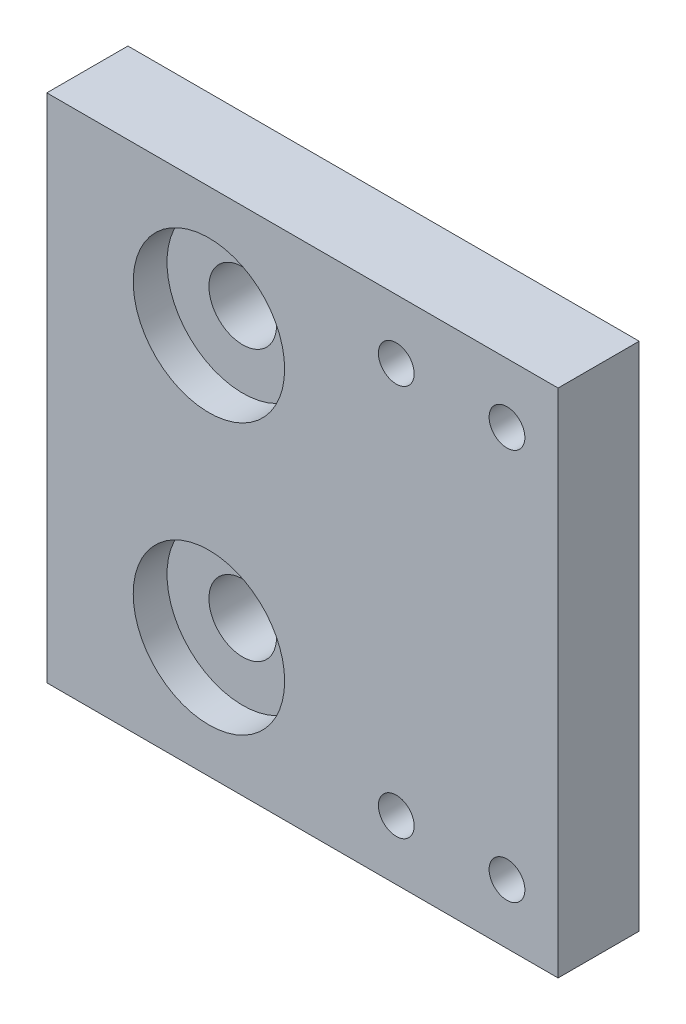
ISO-10303-21;
HEADER;
FILE_DESCRIPTION(('STEP AP214'),'2;1');
FILE_NAME('part.step','',(''),(''),'','','');
FILE_SCHEMA(('AUTOMOTIVE_DESIGN { 1 0 10303 214 1 1 1 1 }'));
ENDSEC;
DATA;
#1=APPLICATION_CONTEXT('core data for automotive mechanical design processes');
#2=APPLICATION_PROTOCOL_DEFINITION('international standard','automotive_design',2000,#1);
#3=PRODUCT_CONTEXT('',#1,'mechanical');
#4=PRODUCT('Part','Part','',(#3));
#5=PRODUCT_RELATED_PRODUCT_CATEGORY('part','',(#4));
#6=PRODUCT_DEFINITION_FORMATION('','',#4);
#7=PRODUCT_DEFINITION_CONTEXT('part definition',#1,'design');
#8=PRODUCT_DEFINITION('design','',#6,#7);
#9=PRODUCT_DEFINITION_SHAPE('','',#8);
#10=(LENGTH_UNIT() NAMED_UNIT(*) SI_UNIT(.MILLI.,.METRE.));
#11=(NAMED_UNIT(*) PLANE_ANGLE_UNIT() SI_UNIT($,.RADIAN.));
#12=(NAMED_UNIT(*) SI_UNIT($,.STERADIAN.) SOLID_ANGLE_UNIT());
#13=UNCERTAINTY_MEASURE_WITH_UNIT(LENGTH_MEASURE(1.E-05),#10,'distance_accuracy_value','');
#14=(GEOMETRIC_REPRESENTATION_CONTEXT(3) GLOBAL_UNCERTAINTY_ASSIGNED_CONTEXT((#13)) GLOBAL_UNIT_ASSIGNED_CONTEXT((#10,
#11,#12)) REPRESENTATION_CONTEXT('',''));
#15=CARTESIAN_POINT('',(0.,0.,0.));
#16=DIRECTION('',(0.,0.,1.));
#17=DIRECTION('',(1.,0.,0.));
#18=AXIS2_PLACEMENT_3D('',#15,#16,#17);
#19=CARTESIAN_POINT('',(295.275000000499,-15.8749999999999,0.));
#20=DIRECTION('',(0.,0.,1.));
#21=DIRECTION('',(1.,0.,0.));
#22=AXIS2_PLACEMENT_3D('',#19,#20,#21);
#23=CYLINDRICAL_SURFACE('',#22,3.96875000000005);
#24=CARTESIAN_POINT('',(295.275000000499,-15.8749999999999,0.));
#25=DIRECTION('',(0.,0.,1.));
#26=DIRECTION('',(1.,0.,0.));
#27=AXIS2_PLACEMENT_3D('',#24,#25,#26);
#28=CIRCLE('',#27,3.96875000000005);
#29=CARTESIAN_POINT('',(299.243750000499,-15.8749999999999,0.));
#30=VERTEX_POINT('',#29);
#31=EDGE_CURVE('E174',#30,#30,#28,.F.);
#32=CARTESIAN_POINT('',(295.275000000499,-15.8749999999999,5.55752));
#33=DIRECTION('',(0.,0.,1.));
#34=DIRECTION('',(1.,0.,0.));
#35=AXIS2_PLACEMENT_3D('',#32,#33,#34);
#36=CIRCLE('',#35,3.96875000000005);
#37=CARTESIAN_POINT('',(299.243750000499,-15.8749999999999,5.55752));
#38=VERTEX_POINT('',#37);
#39=EDGE_CURVE('E182',#38,#38,#36,.F.);
#40=CARTESIAN_POINT('',(299.243750000499,-15.8749999999999,0.));
#41=CARTESIAN_POINT('',(299.243750000499,-15.8749999999999,0.0578908333333333));
#42=CARTESIAN_POINT('',(299.243750000499,-15.8749999999999,0.115781666666667));
#43=CARTESIAN_POINT('',(299.243750000499,-15.8749999999999,0.231563333333333));
#44=CARTESIAN_POINT('',(299.243750000499,-15.8749999999999,0.289454166666667));
#45=CARTESIAN_POINT('',(299.243750000499,-15.8749999999999,0.405235833333333));
#46=CARTESIAN_POINT('',(299.243750000499,-15.8749999999999,0.463126666666667));
#47=CARTESIAN_POINT('',(299.243750000499,-15.8749999999999,0.578908333333333));
#48=CARTESIAN_POINT('',(299.243750000499,-15.8749999999999,0.636799166666667));
#49=CARTESIAN_POINT('',(299.243750000499,-15.8749999999999,0.752580833333333));
#50=CARTESIAN_POINT('',(299.243750000499,-15.8749999999999,0.810471666666666));
#51=CARTESIAN_POINT('',(299.243750000499,-15.8749999999999,0.926253333333333));
#52=CARTESIAN_POINT('',(299.243750000499,-15.8749999999999,0.984144166666666));
#53=CARTESIAN_POINT('',(299.243750000499,-15.8749999999999,1.09992583333333));
#54=CARTESIAN_POINT('',(299.243750000499,-15.8749999999999,1.15781666666667));
#55=CARTESIAN_POINT('',(299.243750000499,-15.8749999999999,1.27359833333333));
#56=CARTESIAN_POINT('',(299.243750000499,-15.8749999999999,1.33148916666667));
#57=CARTESIAN_POINT('',(299.243750000499,-15.8749999999999,1.44727083333333));
#58=CARTESIAN_POINT('',(299.243750000499,-15.8749999999999,1.50516166666667));
#59=CARTESIAN_POINT('',(299.243750000499,-15.8749999999999,1.62094333333333));
#60=CARTESIAN_POINT('',(299.243750000499,-15.8749999999999,1.67883416666667));
#61=CARTESIAN_POINT('',(299.243750000499,-15.8749999999999,1.79461583333333));
#62=CARTESIAN_POINT('',(299.243750000499,-15.8749999999999,1.85250666666667));
#63=CARTESIAN_POINT('',(299.243750000499,-15.8749999999999,1.96828833333333));
#64=CARTESIAN_POINT('',(299.243750000499,-15.8749999999999,2.02617916666667));
#65=CARTESIAN_POINT('',(299.243750000499,-15.8749999999999,2.14196083333333));
#66=CARTESIAN_POINT('',(299.243750000499,-15.8749999999999,2.19985166666667));
#67=CARTESIAN_POINT('',(299.243750000499,-15.8749999999999,2.31563333333333));
#68=CARTESIAN_POINT('',(299.243750000499,-15.8749999999999,2.37352416666667));
#69=CARTESIAN_POINT('',(299.243750000499,-15.8749999999999,2.48930583333333));
#70=CARTESIAN_POINT('',(299.243750000499,-15.8749999999999,2.54719666666667));
#71=CARTESIAN_POINT('',(299.243750000499,-15.8749999999999,2.66297833333333));
#72=CARTESIAN_POINT('',(299.243750000499,-15.8749999999999,2.72086916666667));
#73=CARTESIAN_POINT('',(299.243750000499,-15.8749999999999,2.83665083333333));
#74=CARTESIAN_POINT('',(299.243750000499,-15.8749999999999,2.89454166666667));
#75=CARTESIAN_POINT('',(299.243750000499,-15.8749999999999,3.01032333333333));
#76=CARTESIAN_POINT('',(299.243750000499,-15.8749999999999,3.06821416666667));
#77=CARTESIAN_POINT('',(299.243750000499,-15.8749999999999,3.18399583333333));
#78=CARTESIAN_POINT('',(299.243750000499,-15.8749999999999,3.24188666666667));
#79=CARTESIAN_POINT('',(299.243750000499,-15.8749999999999,3.35766833333333));
#80=CARTESIAN_POINT('',(299.243750000499,-15.8749999999999,3.41555916666667));
#81=CARTESIAN_POINT('',(299.243750000499,-15.8749999999999,3.53134083333333));
#82=CARTESIAN_POINT('',(299.243750000499,-15.8749999999999,3.58923166666667));
#83=CARTESIAN_POINT('',(299.243750000499,-15.8749999999999,3.70501333333333));
#84=CARTESIAN_POINT('',(299.243750000499,-15.8749999999999,3.76290416666667));
#85=CARTESIAN_POINT('',(299.243750000499,-15.8749999999999,3.87868583333333));
#86=CARTESIAN_POINT('',(299.243750000499,-15.8749999999999,3.93657666666667));
#87=CARTESIAN_POINT('',(299.243750000499,-15.8749999999999,4.05235833333333));
#88=CARTESIAN_POINT('',(299.243750000499,-15.8749999999999,4.11024916666667));
#89=CARTESIAN_POINT('',(299.243750000499,-15.8749999999999,4.22603083333333));
#90=CARTESIAN_POINT('',(299.243750000499,-15.8749999999999,4.28392166666667));
#91=CARTESIAN_POINT('',(299.243750000499,-15.8749999999999,4.39970333333333));
#92=CARTESIAN_POINT('',(299.243750000499,-15.8749999999999,4.45759416666667));
#93=CARTESIAN_POINT('',(299.243750000499,-15.8749999999999,4.57337583333333));
#94=CARTESIAN_POINT('',(299.243750000499,-15.8749999999999,4.63126666666667));
#95=CARTESIAN_POINT('',(299.243750000499,-15.8749999999999,4.74704833333333));
#96=CARTESIAN_POINT('',(299.243750000499,-15.8749999999999,4.80493916666667));
#97=CARTESIAN_POINT('',(299.243750000499,-15.8749999999999,4.92072083333333));
#98=CARTESIAN_POINT('',(299.243750000499,-15.8749999999999,4.97861166666667));
#99=CARTESIAN_POINT('',(299.243750000499,-15.8749999999999,5.09439333333333));
#100=CARTESIAN_POINT('',(299.243750000499,-15.8749999999999,5.15228416666667));
#101=CARTESIAN_POINT('',(299.243750000499,-15.8749999999999,5.26806583333333));
#102=CARTESIAN_POINT('',(299.243750000499,-15.8749999999999,5.32595666666667));
#103=CARTESIAN_POINT('',(299.243750000499,-15.8749999999999,5.44173833333333));
#104=CARTESIAN_POINT('',(299.243750000499,-15.8749999999999,5.49962916666667));
#105=CARTESIAN_POINT('',(299.243750000499,-15.8749999999999,5.55752));
#106=B_SPLINE_CURVE_WITH_KNOTS('',3,(#40,#41,#42,#43,#44,#45,#46,#47,#48,#49,#50,#51,#52,#53,
#54,#55,#56,#57,#58,#59,#60,#61,#62,#63,#64,#65,#66,#67,#68,#69,#70,#71,#72,#73,#74,#75,#76,#77,
#78,#79,#80,#81,#82,#83,#84,#85,#86,#87,#88,#89,#90,#91,#92,#93,#94,#95,#96,#97,#98,#99,#100,
#101,#102,#103,#104,#105),.UNSPECIFIED.,.F.,.F.,(4,2,2,2,2,2,2,2,2,2,2,2,2,2,2,2,2,2,2,2,2,2,2,
2,2,2,2,2,2,2,2,2,4),(0.,0.1736725,0.347345,0.5210175,0.69469,0.8683625,1.042035,1.2157075,
1.38938,1.5630525,1.736725,1.9103975,2.08407,2.2577425,2.431415,2.6050875,2.77876,2.9524325,
3.126105,3.2997775,3.47345,3.6471225,3.820795,3.9944675,4.16814,4.3418125,4.515485,4.6891575,
4.86283,5.0365025,5.210175,5.3838475,5.55752),.UNSPECIFIED.);
#107=EDGE_CURVE('BSEAM55',#30,#38,#106,.T.);
#108=ORIENTED_EDGE('',*,*,#31,.T.);
#109=ORIENTED_EDGE('',*,*,#39,.F.);
#110=ORIENTED_EDGE('',*,*,#107,.T.);
#111=ORIENTED_EDGE('',*,*,#107,.F.);
#112=EDGE_LOOP('',(#108,#110,#109,#111));
#113=FACE_BOUND('',#112,.T.);
#114=ADVANCED_FACE('F55',(#113),#23,.F.);
#115=CARTESIAN_POINT('',(295.275000000499,15.8750000000001,0.));
#116=DIRECTION('',(0.,0.,1.));
#117=DIRECTION('',(1.,0.,0.));
#118=AXIS2_PLACEMENT_3D('',#115,#116,#117);
#119=CYLINDRICAL_SURFACE('',#118,3.96875000000005);
#120=CARTESIAN_POINT('',(295.275000000499,15.8750000000001,0.));
#121=DIRECTION('',(0.,0.,1.));
#122=DIRECTION('',(1.,0.,0.));
#123=AXIS2_PLACEMENT_3D('',#120,#121,#122);
#124=CIRCLE('',#123,3.96875000000005);
#125=CARTESIAN_POINT('',(299.243750000499,15.8750000000001,0.));
#126=VERTEX_POINT('',#125);
#127=EDGE_CURVE('E159',#126,#126,#124,.T.);
#128=CARTESIAN_POINT('',(295.275000000499,15.8750000000001,5.55752));
#129=DIRECTION('',(0.,0.,1.));
#130=DIRECTION('',(1.,0.,0.));
#131=AXIS2_PLACEMENT_3D('',#128,#129,#130);
#132=CIRCLE('',#131,3.96875000000005);
#133=CARTESIAN_POINT('',(299.243750000499,15.8750000000001,5.55752));
#134=VERTEX_POINT('',#133);
#135=EDGE_CURVE('E178',#134,#134,#132,.F.);
#136=CARTESIAN_POINT('',(299.243750000499,15.8750000000001,0.));
#137=CARTESIAN_POINT('',(299.243750000499,15.8750000000001,0.0578908333333333));
#138=CARTESIAN_POINT('',(299.243750000499,15.8750000000001,0.115781666666667));
#139=CARTESIAN_POINT('',(299.243750000499,15.8750000000001,0.231563333333333));
#140=CARTESIAN_POINT('',(299.243750000499,15.8750000000001,0.289454166666667));
#141=CARTESIAN_POINT('',(299.243750000499,15.8750000000001,0.405235833333333));
#142=CARTESIAN_POINT('',(299.243750000499,15.8750000000001,0.463126666666667));
#143=CARTESIAN_POINT('',(299.243750000499,15.8750000000001,0.578908333333333));
#144=CARTESIAN_POINT('',(299.243750000499,15.8750000000001,0.636799166666667));
#145=CARTESIAN_POINT('',(299.243750000499,15.8750000000001,0.752580833333333));
#146=CARTESIAN_POINT('',(299.243750000499,15.8750000000001,0.810471666666666));
#147=CARTESIAN_POINT('',(299.243750000499,15.8750000000001,0.926253333333333));
#148=CARTESIAN_POINT('',(299.243750000499,15.8750000000001,0.984144166666666));
#149=CARTESIAN_POINT('',(299.243750000499,15.8750000000001,1.09992583333333));
#150=CARTESIAN_POINT('',(299.243750000499,15.8750000000001,1.15781666666667));
#151=CARTESIAN_POINT('',(299.243750000499,15.8750000000001,1.27359833333333));
#152=CARTESIAN_POINT('',(299.243750000499,15.8750000000001,1.33148916666667));
#153=CARTESIAN_POINT('',(299.243750000499,15.8750000000001,1.44727083333333));
#154=CARTESIAN_POINT('',(299.243750000499,15.8750000000001,1.50516166666667));
#155=CARTESIAN_POINT('',(299.243750000499,15.8750000000001,1.62094333333333));
#156=CARTESIAN_POINT('',(299.243750000499,15.8750000000001,1.67883416666667));
#157=CARTESIAN_POINT('',(299.243750000499,15.8750000000001,1.79461583333333));
#158=CARTESIAN_POINT('',(299.243750000499,15.8750000000001,1.85250666666667));
#159=CARTESIAN_POINT('',(299.243750000499,15.8750000000001,1.96828833333333));
#160=CARTESIAN_POINT('',(299.243750000499,15.8750000000001,2.02617916666667));
#161=CARTESIAN_POINT('',(299.243750000499,15.8750000000001,2.14196083333333));
#162=CARTESIAN_POINT('',(299.243750000499,15.8750000000001,2.19985166666667));
#163=CARTESIAN_POINT('',(299.243750000499,15.8750000000001,2.31563333333333));
#164=CARTESIAN_POINT('',(299.243750000499,15.8750000000001,2.37352416666667));
#165=CARTESIAN_POINT('',(299.243750000499,15.8750000000001,2.48930583333333));
#166=CARTESIAN_POINT('',(299.243750000499,15.8750000000001,2.54719666666667));
#167=CARTESIAN_POINT('',(299.243750000499,15.8750000000001,2.66297833333333));
#168=CARTESIAN_POINT('',(299.243750000499,15.8750000000001,2.72086916666667));
#169=CARTESIAN_POINT('',(299.243750000499,15.8750000000001,2.83665083333333));
#170=CARTESIAN_POINT('',(299.243750000499,15.8750000000001,2.89454166666667));
#171=CARTESIAN_POINT('',(299.243750000499,15.8750000000001,3.01032333333333));
#172=CARTESIAN_POINT('',(299.243750000499,15.8750000000001,3.06821416666667));
#173=CARTESIAN_POINT('',(299.243750000499,15.8750000000001,3.18399583333333));
#174=CARTESIAN_POINT('',(299.243750000499,15.8750000000001,3.24188666666667));
#175=CARTESIAN_POINT('',(299.243750000499,15.8750000000001,3.35766833333333));
#176=CARTESIAN_POINT('',(299.243750000499,15.8750000000001,3.41555916666667));
#177=CARTESIAN_POINT('',(299.243750000499,15.8750000000001,3.53134083333333));
#178=CARTESIAN_POINT('',(299.243750000499,15.8750000000001,3.58923166666667));
#179=CARTESIAN_POINT('',(299.243750000499,15.8750000000001,3.70501333333333));
#180=CARTESIAN_POINT('',(299.243750000499,15.8750000000001,3.76290416666667));
#181=CARTESIAN_POINT('',(299.243750000499,15.8750000000001,3.87868583333333));
#182=CARTESIAN_POINT('',(299.243750000499,15.8750000000001,3.93657666666667));
#183=CARTESIAN_POINT('',(299.243750000499,15.8750000000001,4.05235833333333));
#184=CARTESIAN_POINT('',(299.243750000499,15.8750000000001,4.11024916666667));
#185=CARTESIAN_POINT('',(299.243750000499,15.8750000000001,4.22603083333333));
#186=CARTESIAN_POINT('',(299.243750000499,15.8750000000001,4.28392166666667));
#187=CARTESIAN_POINT('',(299.243750000499,15.8750000000001,4.39970333333333));
#188=CARTESIAN_POINT('',(299.243750000499,15.8750000000001,4.45759416666667));
#189=CARTESIAN_POINT('',(299.243750000499,15.8750000000001,4.57337583333333));
#190=CARTESIAN_POINT('',(299.243750000499,15.8750000000001,4.63126666666667));
#191=CARTESIAN_POINT('',(299.243750000499,15.8750000000001,4.74704833333333));
#192=CARTESIAN_POINT('',(299.243750000499,15.8750000000001,4.80493916666667));
#193=CARTESIAN_POINT('',(299.243750000499,15.8750000000001,4.92072083333333));
#194=CARTESIAN_POINT('',(299.243750000499,15.8750000000001,4.97861166666667));
#195=CARTESIAN_POINT('',(299.243750000499,15.8750000000001,5.09439333333333));
#196=CARTESIAN_POINT('',(299.243750000499,15.8750000000001,5.15228416666667));
#197=CARTESIAN_POINT('',(299.243750000499,15.8750000000001,5.26806583333333));
#198=CARTESIAN_POINT('',(299.243750000499,15.8750000000001,5.32595666666667));
#199=CARTESIAN_POINT('',(299.243750000499,15.8750000000001,5.44173833333333));
#200=CARTESIAN_POINT('',(299.243750000499,15.8750000000001,5.49962916666667));
#201=CARTESIAN_POINT('',(299.243750000499,15.8750000000001,5.55752));
#202=B_SPLINE_CURVE_WITH_KNOTS('',3,(#136,#137,#138,#139,#140,#141,#142,#143,#144,#145,#146,
#147,#148,#149,#150,#151,#152,#153,#154,#155,#156,#157,#158,#159,#160,#161,#162,#163,#164,#165,
#166,#167,#168,#169,#170,#171,#172,#173,#174,#175,#176,#177,#178,#179,#180,#181,#182,#183,#184,
#185,#186,#187,#188,#189,#190,#191,#192,#193,#194,#195,#196,#197,#198,#199,#200,#201),
.UNSPECIFIED.,.F.,.F.,(4,2,2,2,2,2,2,2,2,2,2,2,2,2,2,2,2,2,2,2,2,2,2,2,2,2,2,2,2,2,2,2,4),(0.,
0.1736725,0.347345,0.5210175,0.69469,0.8683625,1.042035,1.2157075,1.38938,1.5630525,1.736725,
1.9103975,2.08407,2.2577425,2.431415,2.6050875,2.77876,2.9524325,3.126105,3.2997775,3.47345,
3.6471225,3.820795,3.9944675,4.16814,4.3418125,4.515485,4.6891575,4.86283,5.0365025,5.210175,
5.3838475,5.55752),.UNSPECIFIED.);
#203=EDGE_CURVE('BSEAM246',#126,#134,#202,.T.);
#204=ORIENTED_EDGE('',*,*,#127,.F.);
#205=ORIENTED_EDGE('',*,*,#135,.F.);
#206=ORIENTED_EDGE('',*,*,#203,.T.);
#207=ORIENTED_EDGE('',*,*,#203,.F.);
#208=EDGE_LOOP('',(#204,#206,#205,#207));
#209=FACE_BOUND('',#208,.T.);
#210=ADVANCED_FACE('F246',(#209),#119,.F.);
#211=CARTESIAN_POINT('',(0.,0.,0.));
#212=DIRECTION('',(0.,0.,1.));
#213=DIRECTION('',(1.,0.,0.));
#214=AXIS2_PLACEMENT_3D('',#211,#212,#213);
#215=PLANE('',#214);
#216=DIRECTION('',(1.,0.,0.));
#217=VECTOR('',#216,1.);
#218=CARTESIAN_POINT('',(0.,29.9999999372043,0.));
#219=LINE('',#218,#217);
#220=CARTESIAN_POINT('',(276.236980653897,29.9999999372045,0.));
#221=VERTEX_POINT('',#220);
#222=CARTESIAN_POINT('',(336.274999942,29.9999999372045,0.));
#223=VERTEX_POINT('',#222);
#224=EDGE_CURVE('E113',#221,#223,#219,.T.);
#225=ORIENTED_EDGE('',*,*,#224,.T.);
#226=DIRECTION('',(0.,-1.,0.));
#227=VECTOR('',#226,1.);
#228=CARTESIAN_POINT('',(336.274999942,29.9999999372045,0.));
#229=LINE('',#228,#227);
#230=CARTESIAN_POINT('',(336.274999942,-29.9999999999999,0.));
#231=VERTEX_POINT('',#230);
#232=EDGE_CURVE('E71',#223,#231,#229,.T.);
#233=ORIENTED_EDGE('',*,*,#232,.T.);
#234=DIRECTION('',(1.,0.,0.));
#235=VECTOR('',#234,1.);
#236=CARTESIAN_POINT('',(0.,-30.0000000627955,0.));
#237=LINE('',#236,#235);
#238=CARTESIAN_POINT('',(276.236980653897,-30.0000000627955,0.));
#239=VERTEX_POINT('',#238);
#240=EDGE_CURVE('E111',#239,#231,#237,.T.);
#241=ORIENTED_EDGE('',*,*,#240,.F.);
#242=DIRECTION('',(0.,-1.,0.));
#243=VECTOR('',#242,1.);
#244=CARTESIAN_POINT('',(276.236980653897,0.,0.));
#245=LINE('',#244,#243);
#246=EDGE_CURVE('E118',#221,#239,#245,.T.);
#247=ORIENTED_EDGE('',*,*,#246,.F.);
#248=EDGE_LOOP('',(#225,#233,#241,#247));
#249=FACE_BOUND('',#248,.T.);
#250=CARTESIAN_POINT('',(317.274999942499,23.,0.));
#251=DIRECTION('',(0.,0.,1.));
#252=DIRECTION('',(1.,0.,0.));
#253=AXIS2_PLACEMENT_3D('',#250,#251,#252);
#254=CIRCLE('',#253,2.09999999999999);
#255=CARTESIAN_POINT('',(319.374999942499,23.,0.));
#256=VERTEX_POINT('',#255);
#257=EDGE_CURVE('E141',#256,#256,#254,.F.);
#258=ORIENTED_EDGE('',*,*,#257,.F.);
#259=EDGE_LOOP('',(#258));
#260=FACE_BOUND('',#259,.T.);
#261=CARTESIAN_POINT('',(330.274999942499,23.,0.));
#262=DIRECTION('',(0.,0.,1.));
#263=DIRECTION('',(1.,0.,0.));
#264=AXIS2_PLACEMENT_3D('',#261,#262,#263);
#265=CIRCLE('',#264,2.09999999999999);
#266=CARTESIAN_POINT('',(332.374999942499,23.,0.));
#267=VERTEX_POINT('',#266);
#268=EDGE_CURVE('E164',#267,#267,#265,.F.);
#269=ORIENTED_EDGE('',*,*,#268,.F.);
#270=EDGE_LOOP('',(#269));
#271=FACE_BOUND('',#270,.T.);
#272=CARTESIAN_POINT('',(330.274999942499,-23.,0.));
#273=DIRECTION('',(0.,0.,1.));
#274=DIRECTION('',(1.,0.,0.));
#275=AXIS2_PLACEMENT_3D('',#272,#273,#274);
#276=CIRCLE('',#275,2.09999999999999);
#277=CARTESIAN_POINT('',(332.374999942499,-23.,0.));
#278=VERTEX_POINT('',#277);
#279=EDGE_CURVE('E154',#278,#278,#276,.F.);
#280=ORIENTED_EDGE('',*,*,#279,.F.);
#281=EDGE_LOOP('',(#280));
#282=FACE_BOUND('',#281,.T.);
#283=CARTESIAN_POINT('',(317.274999942499,-23.,0.));
#284=DIRECTION('',(0.,0.,1.));
#285=DIRECTION('',(1.,0.,0.));
#286=AXIS2_PLACEMENT_3D('',#283,#284,#285);
#287=CIRCLE('',#286,2.09999999999999);
#288=CARTESIAN_POINT('',(319.374999942499,-23.,0.));
#289=VERTEX_POINT('',#288);
#290=EDGE_CURVE('E155',#289,#289,#287,.F.);
#291=ORIENTED_EDGE('',*,*,#290,.F.);
#292=EDGE_LOOP('',(#291));
#293=FACE_BOUND('',#292,.T.);
#294=ORIENTED_EDGE('',*,*,#31,.F.);
#295=EDGE_LOOP('',(#294));
#296=FACE_BOUND('',#295,.T.);
#297=ORIENTED_EDGE('',*,*,#127,.T.);
#298=EDGE_LOOP('',(#297));
#299=FACE_BOUND('',#298,.T.);
#300=ADVANCED_FACE('F109',(#249,#260,#271,#282,#293,#296,#299),#215,.F.);
#301=CARTESIAN_POINT('',(0.,0.,9.525));
#302=DIRECTION('',(0.,0.,1.));
#303=DIRECTION('',(1.,0.,0.));
#304=AXIS2_PLACEMENT_3D('',#301,#302,#303);
#305=PLANE('',#304);
#306=DIRECTION('',(0.,-1.,0.));
#307=VECTOR('',#306,1.);
#308=CARTESIAN_POINT('',(336.274999942,29.9999999372045,9.525));
#309=LINE('',#308,#307);
#310=CARTESIAN_POINT('',(336.274999942,29.9999999372045,9.525));
#311=VERTEX_POINT('',#310);
#312=CARTESIAN_POINT('',(336.274999942,-29.9999999999999,9.525));
#313=VERTEX_POINT('',#312);
#314=EDGE_CURVE('E98',#311,#313,#309,.T.);
#315=ORIENTED_EDGE('',*,*,#314,.F.);
#316=DIRECTION('',(1.,0.,0.));
#317=VECTOR('',#316,1.);
#318=CARTESIAN_POINT('',(0.,29.9999999372043,9.525));
#319=LINE('',#318,#317);
#320=CARTESIAN_POINT('',(276.236980653897,29.9999999372045,9.525));
#321=VERTEX_POINT('',#320);
#322=EDGE_CURVE('E124',#321,#311,#319,.T.);
#323=ORIENTED_EDGE('',*,*,#322,.F.);
#324=DIRECTION('',(0.,-1.,0.));
#325=VECTOR('',#324,1.);
#326=CARTESIAN_POINT('',(276.236980653897,0.,9.525));
#327=LINE('',#326,#325);
#328=CARTESIAN_POINT('',(276.236980653897,-30.0000000627955,9.525));
#329=VERTEX_POINT('',#328);
#330=EDGE_CURVE('E137',#321,#329,#327,.T.);
#331=ORIENTED_EDGE('',*,*,#330,.T.);
#332=DIRECTION('',(1.,0.,0.));
#333=VECTOR('',#332,1.);
#334=CARTESIAN_POINT('',(0.,-30.0000000627955,9.525));
#335=LINE('',#334,#333);
#336=EDGE_CURVE('E134',#329,#313,#335,.T.);
#337=ORIENTED_EDGE('',*,*,#336,.T.);
#338=EDGE_LOOP('',(#315,#323,#331,#337));
#339=FACE_BOUND('',#338,.T.);
#340=CARTESIAN_POINT('',(295.275000000499,15.8750000000001,9.525));
#341=DIRECTION('',(0.,0.,1.));
#342=DIRECTION('',(1.,0.,0.));
#343=AXIS2_PLACEMENT_3D('',#340,#341,#342);
#344=CIRCLE('',#343,8.89000000000001);
#345=CARTESIAN_POINT('',(304.165000000499,15.8750000000001,9.525));
#346=VERTEX_POINT('',#345);
#347=EDGE_CURVE('E186',#346,#346,#344,.T.);
#348=ORIENTED_EDGE('',*,*,#347,.F.);
#349=EDGE_LOOP('',(#348));
#350=FACE_BOUND('',#349,.T.);
#351=CARTESIAN_POINT('',(295.275000000499,-15.8749999999999,9.525));
#352=DIRECTION('',(0.,0.,1.));
#353=DIRECTION('',(-1.,0.,0.));
#354=AXIS2_PLACEMENT_3D('',#351,#352,#353);
#355=CIRCLE('',#354,8.89000000000001);
#356=CARTESIAN_POINT('',(286.385000000499,-15.8749999999999,9.525));
#357=VERTEX_POINT('',#356);
#358=EDGE_CURVE('E104',#357,#357,#355,.T.);
#359=ORIENTED_EDGE('',*,*,#358,.F.);
#360=EDGE_LOOP('',(#359));
#361=FACE_BOUND('',#360,.T.);
#362=CARTESIAN_POINT('',(317.274999942499,-23.,9.525));
#363=DIRECTION('',(0.,0.,1.));
#364=DIRECTION('',(1.,0.,0.));
#365=AXIS2_PLACEMENT_3D('',#362,#363,#364);
#366=CIRCLE('',#365,2.09999999999999);
#367=CARTESIAN_POINT('',(319.374999942499,-23.,9.525));
#368=VERTEX_POINT('',#367);
#369=EDGE_CURVE('E150',#368,#368,#366,.T.);
#370=ORIENTED_EDGE('',*,*,#369,.F.);
#371=EDGE_LOOP('',(#370));
#372=FACE_BOUND('',#371,.T.);
#373=CARTESIAN_POINT('',(330.274999942499,-23.,9.525));
#374=DIRECTION('',(0.,0.,1.));
#375=DIRECTION('',(1.,0.,0.));
#376=AXIS2_PLACEMENT_3D('',#373,#374,#375);
#377=CIRCLE('',#376,2.09999999999999);
#378=CARTESIAN_POINT('',(332.374999942499,-23.,9.525));
#379=VERTEX_POINT('',#378);
#380=EDGE_CURVE('E160',#379,#379,#377,.T.);
#381=ORIENTED_EDGE('',*,*,#380,.F.);
#382=EDGE_LOOP('',(#381));
#383=FACE_BOUND('',#382,.T.);
#384=CARTESIAN_POINT('',(330.274999942499,23.,9.525));
#385=DIRECTION('',(0.,0.,1.));
#386=DIRECTION('',(1.,0.,0.));
#387=AXIS2_PLACEMENT_3D('',#384,#385,#386);
#388=CIRCLE('',#387,2.09999999999999);
#389=CARTESIAN_POINT('',(332.374999942499,23.,9.525));
#390=VERTEX_POINT('',#389);
#391=EDGE_CURVE('E149',#390,#390,#388,.T.);
#392=ORIENTED_EDGE('',*,*,#391,.F.);
#393=EDGE_LOOP('',(#392));
#394=FACE_BOUND('',#393,.T.);
#395=CARTESIAN_POINT('',(317.274999942499,23.,9.525));
#396=DIRECTION('',(0.,0.,1.));
#397=DIRECTION('',(1.,0.,0.));
#398=AXIS2_PLACEMENT_3D('',#395,#396,#397);
#399=CIRCLE('',#398,2.09999999999999);
#400=CARTESIAN_POINT('',(319.374999942499,23.,9.525));
#401=VERTEX_POINT('',#400);
#402=EDGE_CURVE('E145',#401,#401,#399,.T.);
#403=ORIENTED_EDGE('',*,*,#402,.F.);
#404=EDGE_LOOP('',(#403));
#405=FACE_BOUND('',#404,.T.);
#406=ADVANCED_FACE('F234',(#339,#350,#361,#372,#383,#394,#405),#305,.T.);
#407=CARTESIAN_POINT('',(276.236980653897,0.,5.55752));
#408=DIRECTION('',(1.,0.,0.));
#409=DIRECTION('',(0.,0.,-1.));
#410=AXIS2_PLACEMENT_3D('',#407,#408,#409);
#411=PLANE('',#410);
#412=ORIENTED_EDGE('',*,*,#246,.T.);
#413=DIRECTION('',(0.,0.,-1.));
#414=VECTOR('',#413,1.);
#415=CARTESIAN_POINT('',(276.236980653897,-30.0000000627955,5.55752));
#416=LINE('',#415,#414);
#417=EDGE_CURVE('E14',#329,#239,#416,.T.);
#418=ORIENTED_EDGE('',*,*,#417,.F.);
#419=ORIENTED_EDGE('',*,*,#330,.F.);
#420=DIRECTION('',(0.,0.,-1.));
#421=VECTOR('',#420,1.);
#422=CARTESIAN_POINT('',(276.236980653897,29.9999999372045,5.55752));
#423=LINE('',#422,#421);
#424=EDGE_CURVE('E64',#321,#221,#423,.T.);
#425=ORIENTED_EDGE('',*,*,#424,.T.);
#426=EDGE_LOOP('',(#412,#418,#419,#425));
#427=FACE_BOUND('',#426,.T.);
#428=ADVANCED_FACE('F57',(#427),#411,.F.);
#429=CARTESIAN_POINT('',(0.,-30.0000000627955,5.55752));
#430=DIRECTION('',(0.,1.,0.));
#431=DIRECTION('',(-1.,0.,0.));
#432=AXIS2_PLACEMENT_3D('',#429,#430,#431);
#433=PLANE('',#432);
#434=ORIENTED_EDGE('',*,*,#240,.T.);
#435=DIRECTION('',(0.,0.,1.));
#436=VECTOR('',#435,1.);
#437=CARTESIAN_POINT('',(336.274999942,-29.9999999999999,0.));
#438=LINE('',#437,#436);
#439=EDGE_CURVE('E95',#231,#313,#438,.T.);
#440=ORIENTED_EDGE('',*,*,#439,.T.);
#441=ORIENTED_EDGE('',*,*,#336,.F.);
#442=ORIENTED_EDGE('',*,*,#417,.T.);
#443=EDGE_LOOP('',(#434,#440,#441,#442));
#444=FACE_BOUND('',#443,.T.);
#445=ADVANCED_FACE('F116',(#444),#433,.F.);
#446=CARTESIAN_POINT('',(0.,29.9999999372043,5.55752));
#447=DIRECTION('',(0.,1.,0.));
#448=DIRECTION('',(-1.,0.,0.));
#449=AXIS2_PLACEMENT_3D('',#446,#447,#448);
#450=PLANE('',#449);
#451=DIRECTION('',(0.,0.,1.));
#452=VECTOR('',#451,1.);
#453=CARTESIAN_POINT('',(336.274999942,29.9999999372045,0.));
#454=LINE('',#453,#452);
#455=EDGE_CURVE('E105',#223,#311,#454,.T.);
#456=ORIENTED_EDGE('',*,*,#455,.F.);
#457=ORIENTED_EDGE('',*,*,#224,.F.);
#458=ORIENTED_EDGE('',*,*,#424,.F.);
#459=ORIENTED_EDGE('',*,*,#322,.T.);
#460=EDGE_LOOP('',(#456,#457,#458,#459));
#461=FACE_BOUND('',#460,.T.);
#462=ADVANCED_FACE('F236',(#461),#450,.T.);
#463=CARTESIAN_POINT('',(317.274999942499,23.,-5.93969696196697));
#464=DIRECTION('',(0.,0.,1.));
#465=DIRECTION('',(1.,0.,0.));
#466=AXIS2_PLACEMENT_3D('',#463,#464,#465);
#467=CYLINDRICAL_SURFACE('',#466,2.09999999999999);
#468=ORIENTED_EDGE('',*,*,#257,.T.);
#469=EDGE_LOOP('',(#468));
#470=FACE_BOUND('',#469,.T.);
#471=ORIENTED_EDGE('',*,*,#402,.T.);
#472=EDGE_LOOP('',(#471));
#473=FACE_BOUND('',#472,.T.);
#474=ADVANCED_FACE('F262',(#470,#473),#467,.F.);
#475=CARTESIAN_POINT('',(330.274999942499,23.,-5.93969696196697));
#476=DIRECTION('',(0.,0.,1.));
#477=DIRECTION('',(1.,0.,0.));
#478=AXIS2_PLACEMENT_3D('',#475,#476,#477);
#479=CYLINDRICAL_SURFACE('',#478,2.09999999999999);
#480=ORIENTED_EDGE('',*,*,#268,.T.);
#481=EDGE_LOOP('',(#480));
#482=FACE_BOUND('',#481,.T.);
#483=ORIENTED_EDGE('',*,*,#391,.T.);
#484=EDGE_LOOP('',(#483));
#485=FACE_BOUND('',#484,.T.);
#486=ADVANCED_FACE('F258',(#482,#485),#479,.F.);
#487=CARTESIAN_POINT('',(330.274999942499,-23.,-5.93969696196697));
#488=DIRECTION('',(0.,0.,1.));
#489=DIRECTION('',(1.,0.,0.));
#490=AXIS2_PLACEMENT_3D('',#487,#488,#489);
#491=CYLINDRICAL_SURFACE('',#490,2.09999999999999);
#492=ORIENTED_EDGE('',*,*,#279,.T.);
#493=EDGE_LOOP('',(#492));
#494=FACE_BOUND('',#493,.T.);
#495=ORIENTED_EDGE('',*,*,#380,.T.);
#496=EDGE_LOOP('',(#495));
#497=FACE_BOUND('',#496,.T.);
#498=ADVANCED_FACE('F261',(#494,#497),#491,.F.);
#499=CARTESIAN_POINT('',(317.274999942499,-23.,-5.93969696196697));
#500=DIRECTION('',(0.,0.,1.));
#501=DIRECTION('',(1.,0.,0.));
#502=AXIS2_PLACEMENT_3D('',#499,#500,#501);
#503=CYLINDRICAL_SURFACE('',#502,2.09999999999999);
#504=ORIENTED_EDGE('',*,*,#290,.T.);
#505=EDGE_LOOP('',(#504));
#506=FACE_BOUND('',#505,.T.);
#507=ORIENTED_EDGE('',*,*,#369,.T.);
#508=EDGE_LOOP('',(#507));
#509=FACE_BOUND('',#508,.T.);
#510=ADVANCED_FACE('F266',(#506,#509),#503,.F.);
#511=CARTESIAN_POINT('',(295.275000000499,15.8750000000001,-25.1447171389937));
#512=DIRECTION('',(0.,0.,1.));
#513=DIRECTION('',(1.,0.,0.));
#514=AXIS2_PLACEMENT_3D('',#511,#512,#513);
#515=CYLINDRICAL_SURFACE('',#514,8.89000000000001);
#516=CARTESIAN_POINT('',(295.275000000499,15.8750000000001,5.55752));
#517=DIRECTION('',(0.,0.,1.));
#518=DIRECTION('',(1.,0.,0.));
#519=AXIS2_PLACEMENT_3D('',#516,#517,#518);
#520=CIRCLE('',#519,8.89000000000001);
#521=CARTESIAN_POINT('',(304.165000000499,15.8750000000001,5.55752));
#522=VERTEX_POINT('',#521);
#523=EDGE_CURVE('E197',#522,#522,#520,.F.);
#524=ORIENTED_EDGE('',*,*,#523,.T.);
#525=EDGE_LOOP('',(#524));
#526=FACE_BOUND('',#525,.T.);
#527=ORIENTED_EDGE('',*,*,#347,.T.);
#528=EDGE_LOOP('',(#527));
#529=FACE_BOUND('',#528,.T.);
#530=ADVANCED_FACE('F270',(#526,#529),#515,.F.);
#531=CARTESIAN_POINT('',(0.,0.,5.55752));
#532=DIRECTION('',(0.,0.,1.));
#533=DIRECTION('',(1.,0.,0.));
#534=AXIS2_PLACEMENT_3D('',#531,#532,#533);
#535=PLANE('',#534);
#536=ORIENTED_EDGE('',*,*,#523,.F.);
#537=EDGE_LOOP('',(#536));
#538=FACE_BOUND('',#537,.T.);
#539=ORIENTED_EDGE('',*,*,#135,.T.);
#540=EDGE_LOOP('',(#539));
#541=FACE_BOUND('',#540,.T.);
#542=ADVANCED_FACE('F311',(#538,#541),#535,.T.);
#543=CARTESIAN_POINT('',(295.275000000499,-15.8749999999999,-25.1447171389937));
#544=DIRECTION('',(0.,0.,1.));
#545=DIRECTION('',(1.,0.,0.));
#546=AXIS2_PLACEMENT_3D('',#543,#544,#545);
#547=CYLINDRICAL_SURFACE('',#546,8.89000000000001);
#548=CARTESIAN_POINT('',(295.275000000499,-15.8749999999999,5.55752));
#549=DIRECTION('',(0.,0.,1.));
#550=DIRECTION('',(1.,0.,0.));
#551=AXIS2_PLACEMENT_3D('',#548,#549,#550);
#552=CIRCLE('',#551,8.89000000000001);
#553=CARTESIAN_POINT('',(304.165000000499,-15.8749999999999,5.55752));
#554=VERTEX_POINT('',#553);
#555=EDGE_CURVE('E187',#554,#554,#552,.F.);
#556=ORIENTED_EDGE('',*,*,#555,.T.);
#557=EDGE_LOOP('',(#556));
#558=FACE_BOUND('',#557,.T.);
#559=ORIENTED_EDGE('',*,*,#358,.T.);
#560=EDGE_LOOP('',(#559));
#561=FACE_BOUND('',#560,.T.);
#562=ADVANCED_FACE('F320',(#558,#561),#547,.F.);
#563=CARTESIAN_POINT('',(0.,0.,5.55752));
#564=DIRECTION('',(0.,0.,1.));
#565=DIRECTION('',(1.,0.,0.));
#566=AXIS2_PLACEMENT_3D('',#563,#564,#565);
#567=PLANE('',#566);
#568=ORIENTED_EDGE('',*,*,#555,.F.);
#569=EDGE_LOOP('',(#568));
#570=FACE_BOUND('',#569,.T.);
#571=ORIENTED_EDGE('',*,*,#39,.T.);
#572=EDGE_LOOP('',(#571));
#573=FACE_BOUND('',#572,.T.);
#574=ADVANCED_FACE('F329',(#570,#573),#567,.T.);
#575=CARTESIAN_POINT('',(336.274999942,29.9999999372045,0.));
#576=DIRECTION('',(-1.,0.,0.));
#577=DIRECTION('',(0.,0.,1.));
#578=AXIS2_PLACEMENT_3D('',#575,#576,#577);
#579=PLANE('',#578);
#580=ORIENTED_EDGE('',*,*,#314,.T.);
#581=ORIENTED_EDGE('',*,*,#439,.F.);
#582=ORIENTED_EDGE('',*,*,#232,.F.);
#583=ORIENTED_EDGE('',*,*,#455,.T.);
#584=EDGE_LOOP('',(#580,#581,#582,#583));
#585=FACE_BOUND('',#584,.T.);
#586=ADVANCED_FACE('F96',(#585),#579,.F.);
#587=CLOSED_SHELL('',(#114,#210,#300,#406,#428,#445,#462,#474,#486,#498,#510,#530,#542,#562,
#574,#586));
#588=MANIFOLD_SOLID_BREP('B2',#587);
#589=ADVANCED_BREP_SHAPE_REPRESENTATION('',(#18,#588),#14);
#590=SHAPE_DEFINITION_REPRESENTATION(#9,#589);
ENDSEC;
END-ISO-10303-21;
